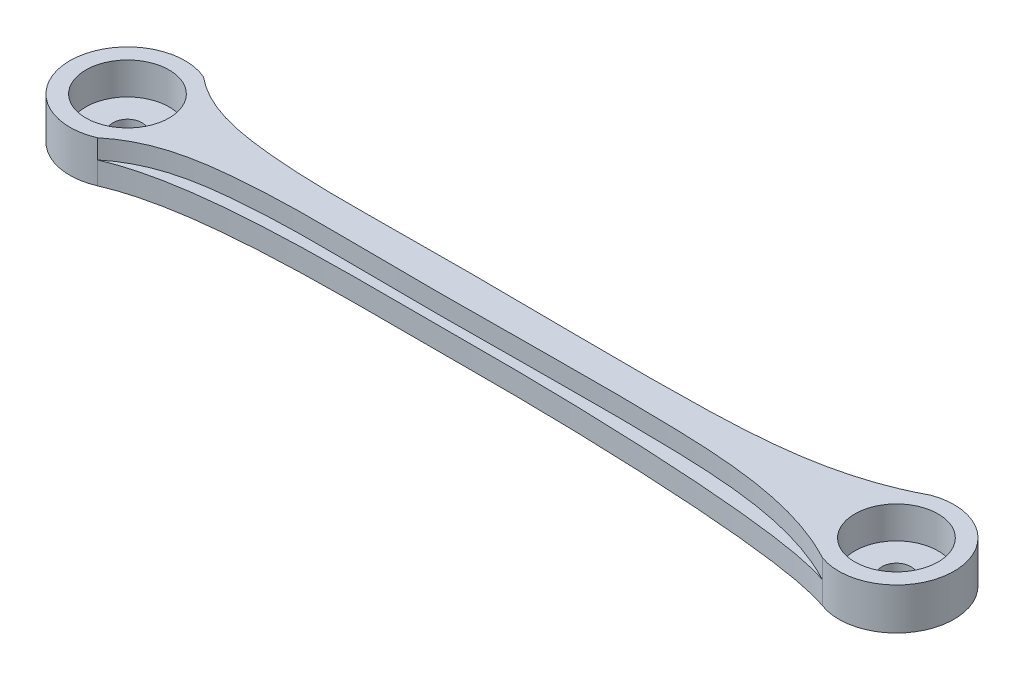
ISO-10303-21;
HEADER;
FILE_DESCRIPTION(('STEP AP214'),'2;1');
FILE_NAME('part.step','',(''),(''),'','','');
FILE_SCHEMA(('AUTOMOTIVE_DESIGN { 1 0 10303 214 1 1 1 1 }'));
ENDSEC;
DATA;
#1=APPLICATION_CONTEXT('core data for automotive mechanical design processes');
#2=APPLICATION_PROTOCOL_DEFINITION('international standard','automotive_design',2000,#1);
#3=PRODUCT_CONTEXT('',#1,'mechanical');
#4=PRODUCT('Part','Part','',(#3));
#5=PRODUCT_RELATED_PRODUCT_CATEGORY('part','',(#4));
#6=PRODUCT_DEFINITION_FORMATION('','',#4);
#7=PRODUCT_DEFINITION_CONTEXT('part definition',#1,'design');
#8=PRODUCT_DEFINITION('design','',#6,#7);
#9=PRODUCT_DEFINITION_SHAPE('','',#8);
#10=(LENGTH_UNIT() NAMED_UNIT(*) SI_UNIT(.MILLI.,.METRE.));
#11=(NAMED_UNIT(*) PLANE_ANGLE_UNIT() SI_UNIT($,.RADIAN.));
#12=(NAMED_UNIT(*) SI_UNIT($,.STERADIAN.) SOLID_ANGLE_UNIT());
#13=UNCERTAINTY_MEASURE_WITH_UNIT(LENGTH_MEASURE(1.E-05),#10,'distance_accuracy_value','');
#14=(GEOMETRIC_REPRESENTATION_CONTEXT(3) GLOBAL_UNCERTAINTY_ASSIGNED_CONTEXT((#13)) GLOBAL_UNIT_ASSIGNED_CONTEXT((#10,
#11,#12)) REPRESENTATION_CONTEXT('',''));
#15=CARTESIAN_POINT('',(0.,0.,0.));
#16=DIRECTION('',(0.,0.,1.));
#17=DIRECTION('',(1.,0.,0.));
#18=AXIS2_PLACEMENT_3D('',#15,#16,#17);
#19=CARTESIAN_POINT('',(-116.409605107802,6.5,8.25282160949067));
#20=CARTESIAN_POINT('',(-105.478903695318,6.5,3.49741353494902));
#21=CARTESIAN_POINT('',(-80.5323545025586,6.5,4.12846793017174));
#22=CARTESIAN_POINT('',(-45.7008945092512,6.5,3.89262781188417));
#23=CARTESIAN_POINT('',(-12.0491512398829,6.5,5.20800150270852));
#24=CARTESIAN_POINT('',(-3.06491546388714,6.5,8.46205017706852));
#25=B_SPLINE_CURVE_WITH_KNOTS('',3,(#19,#20,#21,#22,#23,#24),.UNSPECIFIED.,.F.,.F.,(4,1,1,4),
(0.,0.514412912448133,0.614412912448133,1.),.UNSPECIFIED.);
#26=DIRECTION('',(0.,-1.,0.));
#27=VECTOR('',#26,1.);
#28=SURFACE_OF_LINEAR_EXTRUSION('',#25,#27);
#29=CARTESIAN_POINT('',(-116.409605107802,3.5,8.25282160949067));
#30=CARTESIAN_POINT('',(-105.478903695318,3.5,3.49741353494902));
#31=CARTESIAN_POINT('',(-80.5323545025586,3.5,4.12846793017174));
#32=CARTESIAN_POINT('',(-45.7008945092512,3.5,3.89262781188417));
#33=CARTESIAN_POINT('',(-12.0491512398829,3.5,5.20800150270852));
#34=CARTESIAN_POINT('',(-3.06491546388714,3.5,8.46205017706852));
#35=B_SPLINE_CURVE_WITH_KNOTS('',3,(#29,#30,#31,#32,#33,#34),.UNSPECIFIED.,.F.,.F.,(4,1,1,4),
(0.,0.514412912448133,0.614412912448133,1.),.UNSPECIFIED.);
#36=CARTESIAN_POINT('',(-116.409605107802,3.5,8.25282160949067));
#37=VERTEX_POINT('',#36);
#38=CARTESIAN_POINT('',(-3.06491546388714,3.5,8.46205017706852));
#39=VERTEX_POINT('',#38);
#40=EDGE_CURVE('E249',#37,#39,#35,.T.);
#41=ORIENTED_EDGE('',*,*,#40,.F.);
#42=DIRECTION('',(0.,-1.,0.));
#43=VECTOR('',#42,1.);
#44=CARTESIAN_POINT('',(-116.409605107802,6.5,8.25282160949072));
#45=LINE('',#44,#43);
#46=CARTESIAN_POINT('',(-116.409605107802,0.,8.25282160949072));
#47=VERTEX_POINT('',#46);
#48=EDGE_CURVE('E47',#37,#47,#45,.T.);
#49=ORIENTED_EDGE('',*,*,#48,.T.);
#50=CARTESIAN_POINT('',(-116.409605107802,0.,8.25282160949067));
#51=CARTESIAN_POINT('',(-105.478903695318,0.,3.49741353494902));
#52=CARTESIAN_POINT('',(-80.5323545025586,0.,4.12846793017174));
#53=CARTESIAN_POINT('',(-45.7008945092512,0.,3.89262781188417));
#54=CARTESIAN_POINT('',(-12.0491512398829,0.,5.20800150270852));
#55=CARTESIAN_POINT('',(-3.06491546388714,0.,8.46205017706852));
#56=B_SPLINE_CURVE_WITH_KNOTS('',3,(#50,#51,#52,#53,#54,#55),.UNSPECIFIED.,.F.,.F.,(4,1,1,4),
(0.,0.514412912448133,0.614412912448133,1.),.UNSPECIFIED.);
#57=CARTESIAN_POINT('',(-3.06491546388714,0.,8.46205017706852));
#58=VERTEX_POINT('',#57);
#59=EDGE_CURVE('E97',#47,#58,#56,.T.);
#60=ORIENTED_EDGE('',*,*,#59,.T.);
#61=DIRECTION('',(0.,-1.,0.));
#62=VECTOR('',#61,1.);
#63=CARTESIAN_POINT('',(-3.06491546388714,6.5,8.46205017706852));
#64=LINE('',#63,#62);
#65=EDGE_CURVE('E127',#39,#58,#64,.T.);
#66=ORIENTED_EDGE('',*,*,#65,.F.);
#67=EDGE_LOOP('',(#41,#49,#60,#66));
#68=FACE_BOUND('',#67,.T.);
#69=ADVANCED_FACE('F35',(#68),#28,.F.);
#70=CARTESIAN_POINT('',(-116.409605107802,6.5,-8.25282160949067));
#71=CARTESIAN_POINT('',(-105.478903695318,6.5,-3.49741353494902));
#72=CARTESIAN_POINT('',(-80.5323545025586,6.5,-4.12846793017174));
#73=CARTESIAN_POINT('',(-45.7008945092512,6.5,-3.89262781188417));
#74=CARTESIAN_POINT('',(-12.0491512398829,6.5,-5.20800150270852));
#75=CARTESIAN_POINT('',(-3.06491546388714,6.5,-8.46205017706852));
#76=B_SPLINE_CURVE_WITH_KNOTS('',3,(#70,#71,#72,#73,#74,#75),.UNSPECIFIED.,.F.,.F.,(4,1,1,4),
(0.,0.514412912448133,0.614412912448133,1.),.UNSPECIFIED.);
#77=DIRECTION('',(0.,-1.,0.));
#78=VECTOR('',#77,1.);
#79=SURFACE_OF_LINEAR_EXTRUSION('',#76,#78);
#80=DIRECTION('',(0.,-1.,0.));
#81=VECTOR('',#80,1.);
#82=CARTESIAN_POINT('',(-116.409605107802,6.5,-8.25282160949072));
#83=LINE('',#82,#81);
#84=CARTESIAN_POINT('',(-116.409605107802,3.5,-8.25282160949067));
#85=VERTEX_POINT('',#84);
#86=CARTESIAN_POINT('',(-116.409605107802,0.,-8.25282160949072));
#87=VERTEX_POINT('',#86);
#88=EDGE_CURVE('E80',#85,#87,#83,.T.);
#89=ORIENTED_EDGE('',*,*,#88,.F.);
#90=CARTESIAN_POINT('',(-3.06491546388714,3.5,-8.46205017706852));
#91=CARTESIAN_POINT('',(-12.0491512398829,3.5,-5.20800150270852));
#92=CARTESIAN_POINT('',(-45.7008945092512,3.5,-3.89262781188417));
#93=CARTESIAN_POINT('',(-80.5323545025586,3.5,-4.12846793017174));
#94=CARTESIAN_POINT('',(-105.478903695318,3.5,-3.49741353494902));
#95=CARTESIAN_POINT('',(-116.409605107802,3.5,-8.25282160949067));
#96=B_SPLINE_CURVE_WITH_KNOTS('',3,(#90,#91,#92,#93,#94,#95),.UNSPECIFIED.,.F.,.F.,(4,1,1,4),
(0.,0.385587087551867,0.485587087551867,1.),.UNSPECIFIED.);
#97=CARTESIAN_POINT('',(-3.06491546388714,3.5,-8.46205017706852));
#98=VERTEX_POINT('',#97);
#99=EDGE_CURVE('E139',#98,#85,#96,.T.);
#100=ORIENTED_EDGE('',*,*,#99,.F.);
#101=DIRECTION('',(0.,-1.,0.));
#102=VECTOR('',#101,1.);
#103=CARTESIAN_POINT('',(-3.06491546388714,6.5,-8.46205017706852));
#104=LINE('',#103,#102);
#105=CARTESIAN_POINT('',(-3.06491546388714,0.,-8.46205017706852));
#106=VERTEX_POINT('',#105);
#107=EDGE_CURVE('E74',#98,#106,#104,.T.);
#108=ORIENTED_EDGE('',*,*,#107,.T.);
#109=CARTESIAN_POINT('',(-116.409605107802,0.,-8.25282160949067));
#110=CARTESIAN_POINT('',(-105.478903695318,0.,-3.49741353494902));
#111=CARTESIAN_POINT('',(-80.5323545025586,0.,-4.12846793017174));
#112=CARTESIAN_POINT('',(-45.7008945092512,0.,-3.89262781188417));
#113=CARTESIAN_POINT('',(-12.0491512398829,0.,-5.20800150270852));
#114=CARTESIAN_POINT('',(-3.06491546388714,0.,-8.46205017706852));
#115=B_SPLINE_CURVE_WITH_KNOTS('',3,(#109,#110,#111,#112,#113,#114),.UNSPECIFIED.,.F.,.F.,(4,1,
1,4),(0.,0.514412912448133,0.614412912448133,1.),.UNSPECIFIED.);
#116=EDGE_CURVE('E95',#87,#106,#115,.T.);
#117=ORIENTED_EDGE('',*,*,#116,.F.);
#118=EDGE_LOOP('',(#89,#100,#108,#117));
#119=FACE_BOUND('',#118,.T.);
#120=ADVANCED_FACE('F100',(#119),#79,.T.);
#121=CARTESIAN_POINT('',(0.,6.5,0.));
#122=DIRECTION('',(0.,1.,0.));
#123=DIRECTION('',(0.,0.,1.));
#124=AXIS2_PLACEMENT_3D('',#121,#122,#123);
#125=PLANE('',#124);
#126=CARTESIAN_POINT('',(-120.,6.5,0.));
#127=DIRECTION('',(0.,1.,0.));
#128=DIRECTION('',(0.,0.,1.));
#129=AXIS2_PLACEMENT_3D('',#126,#127,#128);
#130=CIRCLE('',#129,6.5);
#131=CARTESIAN_POINT('',(-120.,6.5,6.5));
#132=VERTEX_POINT('',#131);
#133=EDGE_CURVE('E258',#132,#132,#130,.T.);
#134=ORIENTED_EDGE('',*,*,#133,.F.);
#135=EDGE_LOOP('',(#134));
#136=FACE_BOUND('',#135,.T.);
#137=CARTESIAN_POINT('',(0.,6.5,0.));
#138=DIRECTION('',(0.,1.,0.));
#139=DIRECTION('',(0.,0.,1.));
#140=AXIS2_PLACEMENT_3D('',#137,#138,#139);
#141=CIRCLE('',#140,6.5);
#142=CARTESIAN_POINT('',(0.,6.5,6.5));
#143=VERTEX_POINT('',#142);
#144=EDGE_CURVE('E250',#143,#143,#141,.T.);
#145=ORIENTED_EDGE('',*,*,#144,.F.);
#146=EDGE_LOOP('',(#145));
#147=FACE_BOUND('',#146,.T.);
#148=CARTESIAN_POINT('',(-120.,6.5,0.));
#149=DIRECTION('',(0.,1.,0.));
#150=DIRECTION('',(0.,0.,1.));
#151=AXIS2_PLACEMENT_3D('',#148,#149,#150);
#152=CIRCLE('',#151,9.00000000000001);
#153=CARTESIAN_POINT('',(-116.409605107802,6.5,-8.25282160949072));
#154=VERTEX_POINT('',#153);
#155=CARTESIAN_POINT('',(-116.409605107802,6.5,8.25282160949067));
#156=VERTEX_POINT('',#155);
#157=EDGE_CURVE('E105',#154,#156,#152,.T.);
#158=ORIENTED_EDGE('',*,*,#157,.T.);
#159=CARTESIAN_POINT('',(-116.409605107802,6.5,8.25282160949072));
#160=CARTESIAN_POINT('',(-111.92652513617,6.5,4.51507354203544));
#161=CARTESIAN_POINT('',(-103.615159098178,6.5,3.00784573614782));
#162=CARTESIAN_POINT('',(-91.2207000098577,6.5,2.34725529869159));
#163=CARTESIAN_POINT('',(-77.8490213730049,6.5,2.56845612583095));
#164=CARTESIAN_POINT('',(-58.0096037549966,6.5,2.53414615049835));
#165=CARTESIAN_POINT('',(-32.0984882387546,6.5,2.11769764582483));
#166=CARTESIAN_POINT('',(-12.4420818931349,6.5,3.45207722822936));
#167=CARTESIAN_POINT('',(-3.06491546388714,6.5,8.46205017706852));
#168=B_SPLINE_CURVE_WITH_KNOTS('',3,(#159,#160,#161,#162,#163,#164,#165,#166,#167),
.UNSPECIFIED.,.F.,.F.,(4,1,1,1,1,1,4),(0.,0.145433364154235,0.214931864826638,0.323765467036158,
0.493222334574271,0.731337307454408,1.),.UNSPECIFIED.);
#169=CARTESIAN_POINT('',(-3.06491546388714,6.5,8.46205017706852));
#170=VERTEX_POINT('',#169);
#171=EDGE_CURVE('E154',#156,#170,#168,.T.);
#172=ORIENTED_EDGE('',*,*,#171,.T.);
#173=CARTESIAN_POINT('',(0.,6.5,0.));
#174=DIRECTION('',(0.,1.,0.));
#175=DIRECTION('',(0.,0.,1.));
#176=AXIS2_PLACEMENT_3D('',#173,#174,#175);
#177=CIRCLE('',#176,9.);
#178=CARTESIAN_POINT('',(-3.06491546388714,6.5,-8.46205017706852));
#179=VERTEX_POINT('',#178);
#180=EDGE_CURVE('E87',#170,#179,#177,.T.);
#181=ORIENTED_EDGE('',*,*,#180,.T.);
#182=CARTESIAN_POINT('',(-116.409605107802,6.5,-8.25282160949072));
#183=CARTESIAN_POINT('',(-111.92652513617,6.5,-4.51507354203544));
#184=CARTESIAN_POINT('',(-103.615159098178,6.5,-3.00784573614782));
#185=CARTESIAN_POINT('',(-91.2207000098578,6.5,-2.34725529869159));
#186=CARTESIAN_POINT('',(-77.8490213730049,6.5,-2.56845612583095));
#187=CARTESIAN_POINT('',(-58.0096037549966,6.5,-2.53414615049835));
#188=CARTESIAN_POINT('',(-32.0984882387547,6.5,-2.11769764582483));
#189=CARTESIAN_POINT('',(-12.4420818931349,6.5,-3.45207722822936));
#190=CARTESIAN_POINT('',(-3.06491546388714,6.5,-8.46205017706852));
#191=B_SPLINE_CURVE_WITH_KNOTS('',3,(#182,#183,#184,#185,#186,#187,#188,#189,#190),
.UNSPECIFIED.,.F.,.F.,(4,1,1,1,1,1,4),(0.,0.145433364154235,0.214931864826638,0.323765467036158,
0.493222334574271,0.731337307454408,1.),.UNSPECIFIED.);
#192=EDGE_CURVE('E143',#154,#179,#191,.T.);
#193=ORIENTED_EDGE('',*,*,#192,.F.);
#194=EDGE_LOOP('',(#158,#172,#181,#193));
#195=FACE_BOUND('',#194,.T.);
#196=ADVANCED_FACE('F194',(#136,#147,#195),#125,.T.);
#197=CARTESIAN_POINT('',(-120.,6.5,0.));
#198=DIRECTION('',(0.,-1.,0.));
#199=DIRECTION('',(0.,0.,-1.));
#200=AXIS2_PLACEMENT_3D('',#197,#198,#199);
#201=CYLINDRICAL_SURFACE('',#200,2.25);
#202=CARTESIAN_POINT('',(-120.,0.,0.));
#203=DIRECTION('',(0.,1.,0.));
#204=DIRECTION('',(0.,0.,1.));
#205=AXIS2_PLACEMENT_3D('',#202,#203,#204);
#206=CIRCLE('',#205,2.25);
#207=CARTESIAN_POINT('',(-120.,0.,-2.25));
#208=VERTEX_POINT('',#207);
#209=EDGE_CURVE('E98',#208,#208,#206,.T.);
#210=CARTESIAN_POINT('',(-120.,1.5,0.));
#211=DIRECTION('',(0.,1.,0.));
#212=DIRECTION('',(0.,0.,1.));
#213=AXIS2_PLACEMENT_3D('',#210,#211,#212);
#214=CIRCLE('',#213,2.25);
#215=CARTESIAN_POINT('',(-120.,1.5,-2.25));
#216=VERTEX_POINT('',#215);
#217=EDGE_CURVE('E220',#216,#216,#214,.T.);
#218=CARTESIAN_POINT('',(-120.,0.,-2.25));
#219=CARTESIAN_POINT('',(-120.,0.015625,-2.25));
#220=CARTESIAN_POINT('',(-120.,0.03125,-2.25));
#221=CARTESIAN_POINT('',(-120.,0.0625000000000001,-2.25));
#222=CARTESIAN_POINT('',(-120.,0.0781250000000001,-2.25));
#223=CARTESIAN_POINT('',(-120.,0.109375,-2.25));
#224=CARTESIAN_POINT('',(-120.,0.125,-2.25));
#225=CARTESIAN_POINT('',(-120.,0.15625,-2.25));
#226=CARTESIAN_POINT('',(-120.,0.171875,-2.25));
#227=CARTESIAN_POINT('',(-120.,0.203125,-2.25));
#228=CARTESIAN_POINT('',(-120.,0.21875,-2.25));
#229=CARTESIAN_POINT('',(-120.,0.25,-2.25));
#230=CARTESIAN_POINT('',(-120.,0.265625,-2.25));
#231=CARTESIAN_POINT('',(-120.,0.296875,-2.25));
#232=CARTESIAN_POINT('',(-120.,0.3125,-2.25));
#233=CARTESIAN_POINT('',(-120.,0.34375,-2.25));
#234=CARTESIAN_POINT('',(-120.,0.359375,-2.25));
#235=CARTESIAN_POINT('',(-120.,0.390625,-2.25));
#236=CARTESIAN_POINT('',(-120.,0.40625,-2.25));
#237=CARTESIAN_POINT('',(-120.,0.4375,-2.25));
#238=CARTESIAN_POINT('',(-120.,0.453125,-2.25));
#239=CARTESIAN_POINT('',(-120.,0.484375,-2.25));
#240=CARTESIAN_POINT('',(-120.,0.5,-2.25));
#241=CARTESIAN_POINT('',(-120.,0.53125,-2.25));
#242=CARTESIAN_POINT('',(-120.,0.546875,-2.25));
#243=CARTESIAN_POINT('',(-120.,0.578125,-2.25));
#244=CARTESIAN_POINT('',(-120.,0.59375,-2.25));
#245=CARTESIAN_POINT('',(-120.,0.625,-2.25));
#246=CARTESIAN_POINT('',(-120.,0.640625,-2.25));
#247=CARTESIAN_POINT('',(-120.,0.671875,-2.25));
#248=CARTESIAN_POINT('',(-120.,0.6875,-2.25));
#249=CARTESIAN_POINT('',(-120.,0.71875,-2.25));
#250=CARTESIAN_POINT('',(-120.,0.734375,-2.25));
#251=CARTESIAN_POINT('',(-120.,0.765625,-2.25));
#252=CARTESIAN_POINT('',(-120.,0.78125,-2.25));
#253=CARTESIAN_POINT('',(-120.,0.8125,-2.25));
#254=CARTESIAN_POINT('',(-120.,0.828125,-2.25));
#255=CARTESIAN_POINT('',(-120.,0.859375,-2.25));
#256=CARTESIAN_POINT('',(-120.,0.875,-2.25));
#257=CARTESIAN_POINT('',(-120.,0.90625,-2.25));
#258=CARTESIAN_POINT('',(-120.,0.921875,-2.25));
#259=CARTESIAN_POINT('',(-120.,0.953125,-2.25));
#260=CARTESIAN_POINT('',(-120.,0.96875,-2.25));
#261=CARTESIAN_POINT('',(-120.,1.,-2.25));
#262=CARTESIAN_POINT('',(-120.,1.015625,-2.25));
#263=CARTESIAN_POINT('',(-120.,1.046875,-2.25));
#264=CARTESIAN_POINT('',(-120.,1.0625,-2.25));
#265=CARTESIAN_POINT('',(-120.,1.09375,-2.25));
#266=CARTESIAN_POINT('',(-120.,1.109375,-2.25));
#267=CARTESIAN_POINT('',(-120.,1.140625,-2.25));
#268=CARTESIAN_POINT('',(-120.,1.15625,-2.25));
#269=CARTESIAN_POINT('',(-120.,1.1875,-2.25));
#270=CARTESIAN_POINT('',(-120.,1.203125,-2.25));
#271=CARTESIAN_POINT('',(-120.,1.234375,-2.25));
#272=CARTESIAN_POINT('',(-120.,1.25,-2.25));
#273=CARTESIAN_POINT('',(-120.,1.28125,-2.25));
#274=CARTESIAN_POINT('',(-120.,1.296875,-2.25));
#275=CARTESIAN_POINT('',(-120.,1.328125,-2.25));
#276=CARTESIAN_POINT('',(-120.,1.34375,-2.25));
#277=CARTESIAN_POINT('',(-120.,1.375,-2.25));
#278=CARTESIAN_POINT('',(-120.,1.390625,-2.25));
#279=CARTESIAN_POINT('',(-120.,1.421875,-2.25));
#280=CARTESIAN_POINT('',(-120.,1.4375,-2.25));
#281=CARTESIAN_POINT('',(-120.,1.46875,-2.25));
#282=CARTESIAN_POINT('',(-120.,1.484375,-2.25));
#283=CARTESIAN_POINT('',(-120.,1.5,-2.25));
#284=B_SPLINE_CURVE_WITH_KNOTS('',3,(#218,#219,#220,#221,#222,#223,#224,#225,#226,#227,#228,
#229,#230,#231,#232,#233,#234,#235,#236,#237,#238,#239,#240,#241,#242,#243,#244,#245,#246,#247,
#248,#249,#250,#251,#252,#253,#254,#255,#256,#257,#258,#259,#260,#261,#262,#263,#264,#265,#266,
#267,#268,#269,#270,#271,#272,#273,#274,#275,#276,#277,#278,#279,#280,#281,#282,#283),
.UNSPECIFIED.,.F.,.F.,(4,2,2,2,2,2,2,2,2,2,2,2,2,2,2,2,2,2,2,2,2,2,2,2,2,2,2,2,2,2,2,2,4),(0.,
0.046875,0.0937500000000001,0.140625,0.1875,0.234375,0.28125,0.328125,0.375,0.421875,0.46875,
0.515625,0.5625,0.609375,0.65625,0.703125,0.75,0.796875,0.84375,0.890625,0.9375,0.984375,
1.03125,1.078125,1.125,1.171875,1.21875,1.265625,1.3125,1.359375,1.40625,1.453125,1.5),.UNSPECIFIED.);
#285=EDGE_CURVE('BSEAM37',#208,#216,#284,.T.);
#286=ORIENTED_EDGE('',*,*,#209,.F.);
#287=ORIENTED_EDGE('',*,*,#217,.T.);
#288=ORIENTED_EDGE('',*,*,#285,.T.);
#289=ORIENTED_EDGE('',*,*,#285,.F.);
#290=EDGE_LOOP('',(#286,#288,#287,#289));
#291=FACE_BOUND('',#290,.T.);
#292=ADVANCED_FACE('F37',(#291),#201,.F.);
#293=CARTESIAN_POINT('',(0.,6.5,0.));
#294=DIRECTION('',(0.,-1.,0.));
#295=DIRECTION('',(0.,0.,-1.));
#296=AXIS2_PLACEMENT_3D('',#293,#294,#295);
#297=CYLINDRICAL_SURFACE('',#296,2.25);
#298=CARTESIAN_POINT('',(0.,0.,0.));
#299=DIRECTION('',(0.,1.,0.));
#300=DIRECTION('',(0.,0.,1.));
#301=AXIS2_PLACEMENT_3D('',#298,#299,#300);
#302=CIRCLE('',#301,2.25);
#303=CARTESIAN_POINT('',(0.,0.,-2.25));
#304=VERTEX_POINT('',#303);
#305=EDGE_CURVE('E101',#304,#304,#302,.T.);
#306=CARTESIAN_POINT('',(0.,1.5,0.));
#307=DIRECTION('',(0.,1.,0.));
#308=DIRECTION('',(0.,0.,1.));
#309=AXIS2_PLACEMENT_3D('',#306,#307,#308);
#310=CIRCLE('',#309,2.25);
#311=CARTESIAN_POINT('',(0.,1.5,-2.25));
#312=VERTEX_POINT('',#311);
#313=EDGE_CURVE('E136',#312,#312,#310,.T.);
#314=CARTESIAN_POINT('',(0.,0.,-2.25));
#315=CARTESIAN_POINT('',(0.,0.015625,-2.25));
#316=CARTESIAN_POINT('',(0.,0.03125,-2.25));
#317=CARTESIAN_POINT('',(0.,0.0625000000000001,-2.25));
#318=CARTESIAN_POINT('',(0.,0.0781250000000001,-2.25));
#319=CARTESIAN_POINT('',(0.,0.109375,-2.25));
#320=CARTESIAN_POINT('',(0.,0.125,-2.25));
#321=CARTESIAN_POINT('',(0.,0.15625,-2.25));
#322=CARTESIAN_POINT('',(0.,0.171875,-2.25));
#323=CARTESIAN_POINT('',(0.,0.203125,-2.25));
#324=CARTESIAN_POINT('',(0.,0.21875,-2.25));
#325=CARTESIAN_POINT('',(0.,0.25,-2.25));
#326=CARTESIAN_POINT('',(0.,0.265625,-2.25));
#327=CARTESIAN_POINT('',(0.,0.296875,-2.25));
#328=CARTESIAN_POINT('',(0.,0.3125,-2.25));
#329=CARTESIAN_POINT('',(0.,0.34375,-2.25));
#330=CARTESIAN_POINT('',(0.,0.359375,-2.25));
#331=CARTESIAN_POINT('',(0.,0.390625,-2.25));
#332=CARTESIAN_POINT('',(0.,0.40625,-2.25));
#333=CARTESIAN_POINT('',(0.,0.4375,-2.25));
#334=CARTESIAN_POINT('',(0.,0.453125,-2.25));
#335=CARTESIAN_POINT('',(0.,0.484375,-2.25));
#336=CARTESIAN_POINT('',(0.,0.5,-2.25));
#337=CARTESIAN_POINT('',(0.,0.53125,-2.25));
#338=CARTESIAN_POINT('',(0.,0.546875,-2.25));
#339=CARTESIAN_POINT('',(0.,0.578125,-2.25));
#340=CARTESIAN_POINT('',(0.,0.59375,-2.25));
#341=CARTESIAN_POINT('',(0.,0.625,-2.25));
#342=CARTESIAN_POINT('',(0.,0.640625,-2.25));
#343=CARTESIAN_POINT('',(0.,0.671875,-2.25));
#344=CARTESIAN_POINT('',(0.,0.6875,-2.25));
#345=CARTESIAN_POINT('',(0.,0.71875,-2.25));
#346=CARTESIAN_POINT('',(0.,0.734375,-2.25));
#347=CARTESIAN_POINT('',(0.,0.765625,-2.25));
#348=CARTESIAN_POINT('',(0.,0.78125,-2.25));
#349=CARTESIAN_POINT('',(0.,0.8125,-2.25));
#350=CARTESIAN_POINT('',(0.,0.828125,-2.25));
#351=CARTESIAN_POINT('',(0.,0.859375,-2.25));
#352=CARTESIAN_POINT('',(0.,0.875,-2.25));
#353=CARTESIAN_POINT('',(0.,0.90625,-2.25));
#354=CARTESIAN_POINT('',(0.,0.921875,-2.25));
#355=CARTESIAN_POINT('',(0.,0.953125,-2.25));
#356=CARTESIAN_POINT('',(0.,0.96875,-2.25));
#357=CARTESIAN_POINT('',(0.,1.,-2.25));
#358=CARTESIAN_POINT('',(0.,1.015625,-2.25));
#359=CARTESIAN_POINT('',(0.,1.046875,-2.25));
#360=CARTESIAN_POINT('',(0.,1.0625,-2.25));
#361=CARTESIAN_POINT('',(0.,1.09375,-2.25));
#362=CARTESIAN_POINT('',(0.,1.109375,-2.25));
#363=CARTESIAN_POINT('',(0.,1.140625,-2.25));
#364=CARTESIAN_POINT('',(0.,1.15625,-2.25));
#365=CARTESIAN_POINT('',(0.,1.1875,-2.25));
#366=CARTESIAN_POINT('',(0.,1.203125,-2.25));
#367=CARTESIAN_POINT('',(0.,1.234375,-2.25));
#368=CARTESIAN_POINT('',(0.,1.25,-2.25));
#369=CARTESIAN_POINT('',(0.,1.28125,-2.25));
#370=CARTESIAN_POINT('',(0.,1.296875,-2.25));
#371=CARTESIAN_POINT('',(0.,1.328125,-2.25));
#372=CARTESIAN_POINT('',(0.,1.34375,-2.25));
#373=CARTESIAN_POINT('',(0.,1.375,-2.25));
#374=CARTESIAN_POINT('',(0.,1.390625,-2.25));
#375=CARTESIAN_POINT('',(0.,1.421875,-2.25));
#376=CARTESIAN_POINT('',(0.,1.4375,-2.25));
#377=CARTESIAN_POINT('',(0.,1.46875,-2.25));
#378=CARTESIAN_POINT('',(0.,1.484375,-2.25));
#379=CARTESIAN_POINT('',(0.,1.5,-2.25));
#380=B_SPLINE_CURVE_WITH_KNOTS('',3,(#314,#315,#316,#317,#318,#319,#320,#321,#322,#323,#324,
#325,#326,#327,#328,#329,#330,#331,#332,#333,#334,#335,#336,#337,#338,#339,#340,#341,#342,#343,
#344,#345,#346,#347,#348,#349,#350,#351,#352,#353,#354,#355,#356,#357,#358,#359,#360,#361,#362,
#363,#364,#365,#366,#367,#368,#369,#370,#371,#372,#373,#374,#375,#376,#377,#378,#379),
.UNSPECIFIED.,.F.,.F.,(4,2,2,2,2,2,2,2,2,2,2,2,2,2,2,2,2,2,2,2,2,2,2,2,2,2,2,2,2,2,2,2,4),(0.,
0.046875,0.0937500000000001,0.140625,0.1875,0.234375,0.28125,0.328125,0.375,0.421875,0.46875,
0.515625,0.5625,0.609375,0.65625,0.703125,0.75,0.796875,0.84375,0.890625,0.9375,0.984375,
1.03125,1.078125,1.125,1.171875,1.21875,1.265625,1.3125,1.359375,1.40625,1.453125,1.5),.UNSPECIFIED.);
#381=EDGE_CURVE('BSEAM202',#304,#312,#380,.T.);
#382=ORIENTED_EDGE('',*,*,#305,.F.);
#383=ORIENTED_EDGE('',*,*,#313,.T.);
#384=ORIENTED_EDGE('',*,*,#381,.T.);
#385=ORIENTED_EDGE('',*,*,#381,.F.);
#386=EDGE_LOOP('',(#382,#384,#383,#385));
#387=FACE_BOUND('',#386,.T.);
#388=ADVANCED_FACE('F202',(#387),#297,.F.);
#389=CARTESIAN_POINT('',(-120.,6.5,0.));
#390=DIRECTION('',(0.,-1.,0.));
#391=DIRECTION('',(0.,0.,-1.));
#392=AXIS2_PLACEMENT_3D('',#389,#390,#391);
#393=CYLINDRICAL_SURFACE('',#392,9.00000000000001);
#394=CARTESIAN_POINT('',(-120.,0.,0.));
#395=DIRECTION('',(0.,1.,0.));
#396=DIRECTION('',(0.,0.,1.));
#397=AXIS2_PLACEMENT_3D('',#394,#395,#396);
#398=CIRCLE('',#397,9.00000000000001);
#399=EDGE_CURVE('E84',#87,#47,#398,.T.);
#400=ORIENTED_EDGE('',*,*,#399,.T.);
#401=ORIENTED_EDGE('',*,*,#48,.F.);
#402=EDGE_CURVE('E11',#156,#37,#45,.T.);
#403=ORIENTED_EDGE('',*,*,#402,.F.);
#404=ORIENTED_EDGE('',*,*,#157,.F.);
#405=EDGE_CURVE('E56',#154,#85,#83,.T.);
#406=ORIENTED_EDGE('',*,*,#405,.T.);
#407=ORIENTED_EDGE('',*,*,#88,.T.);
#408=EDGE_LOOP('',(#400,#401,#403,#404,#406,#407));
#409=FACE_BOUND('',#408,.T.);
#410=ADVANCED_FACE('F82',(#409),#393,.T.);
#411=CARTESIAN_POINT('',(0.,6.5,0.));
#412=DIRECTION('',(0.,-1.,0.));
#413=DIRECTION('',(0.,0.,-1.));
#414=AXIS2_PLACEMENT_3D('',#411,#412,#413);
#415=CYLINDRICAL_SURFACE('',#414,9.);
#416=CARTESIAN_POINT('',(0.,0.,0.));
#417=DIRECTION('',(0.,1.,0.));
#418=DIRECTION('',(0.,0.,1.));
#419=AXIS2_PLACEMENT_3D('',#416,#417,#418);
#420=CIRCLE('',#419,9.);
#421=EDGE_CURVE('E102',#58,#106,#420,.T.);
#422=ORIENTED_EDGE('',*,*,#421,.T.);
#423=ORIENTED_EDGE('',*,*,#107,.F.);
#424=EDGE_CURVE('E124',#179,#98,#104,.T.);
#425=ORIENTED_EDGE('',*,*,#424,.F.);
#426=ORIENTED_EDGE('',*,*,#180,.F.);
#427=EDGE_CURVE('E129',#170,#39,#64,.T.);
#428=ORIENTED_EDGE('',*,*,#427,.T.);
#429=ORIENTED_EDGE('',*,*,#65,.T.);
#430=EDGE_LOOP('',(#422,#423,#425,#426,#428,#429));
#431=FACE_BOUND('',#430,.T.);
#432=ADVANCED_FACE('F200',(#431),#415,.T.);
#433=CARTESIAN_POINT('',(0.,0.,0.));
#434=DIRECTION('',(0.,1.,0.));
#435=DIRECTION('',(0.,0.,1.));
#436=AXIS2_PLACEMENT_3D('',#433,#434,#435);
#437=PLANE('',#436);
#438=ORIENTED_EDGE('',*,*,#209,.T.);
#439=EDGE_LOOP('',(#438));
#440=FACE_BOUND('',#439,.T.);
#441=ORIENTED_EDGE('',*,*,#399,.F.);
#442=ORIENTED_EDGE('',*,*,#116,.T.);
#443=ORIENTED_EDGE('',*,*,#421,.F.);
#444=ORIENTED_EDGE('',*,*,#59,.F.);
#445=EDGE_LOOP('',(#441,#442,#443,#444));
#446=FACE_BOUND('',#445,.T.);
#447=ORIENTED_EDGE('',*,*,#305,.T.);
#448=EDGE_LOOP('',(#447));
#449=FACE_BOUND('',#448,.T.);
#450=ADVANCED_FACE('F92',(#440,#446,#449),#437,.F.);
#451=CARTESIAN_POINT('',(0.,1.5,0.));
#452=DIRECTION('',(0.,1.,0.));
#453=DIRECTION('',(0.,0.,1.));
#454=AXIS2_PLACEMENT_3D('',#451,#452,#453);
#455=CYLINDRICAL_SURFACE('',#454,6.5);
#456=CARTESIAN_POINT('',(0.,1.5,0.));
#457=DIRECTION('',(0.,1.,0.));
#458=DIRECTION('',(0.,0.,1.));
#459=AXIS2_PLACEMENT_3D('',#456,#457,#458);
#460=CIRCLE('',#459,6.5);
#461=CARTESIAN_POINT('',(0.,1.5,6.5));
#462=VERTEX_POINT('',#461);
#463=EDGE_CURVE('E253',#462,#462,#460,.T.);
#464=ORIENTED_EDGE('',*,*,#463,.F.);
#465=EDGE_LOOP('',(#464));
#466=FACE_BOUND('',#465,.T.);
#467=ORIENTED_EDGE('',*,*,#144,.T.);
#468=EDGE_LOOP('',(#467));
#469=FACE_BOUND('',#468,.T.);
#470=ADVANCED_FACE('F189',(#466,#469),#455,.F.);
#471=CARTESIAN_POINT('',(0.,1.5,0.));
#472=DIRECTION('',(0.,1.,0.));
#473=DIRECTION('',(0.,0.,1.));
#474=AXIS2_PLACEMENT_3D('',#471,#472,#473);
#475=PLANE('',#474);
#476=ORIENTED_EDGE('',*,*,#313,.F.);
#477=EDGE_LOOP('',(#476));
#478=FACE_BOUND('',#477,.T.);
#479=ORIENTED_EDGE('',*,*,#463,.T.);
#480=EDGE_LOOP('',(#479));
#481=FACE_BOUND('',#480,.T.);
#482=ADVANCED_FACE('F185',(#478,#481),#475,.T.);
#483=CARTESIAN_POINT('',(-120.,1.5,0.));
#484=DIRECTION('',(0.,1.,0.));
#485=DIRECTION('',(0.,0.,1.));
#486=AXIS2_PLACEMENT_3D('',#483,#484,#485);
#487=CYLINDRICAL_SURFACE('',#486,6.5);
#488=CARTESIAN_POINT('',(-120.,1.5,0.));
#489=DIRECTION('',(0.,1.,0.));
#490=DIRECTION('',(0.,0.,1.));
#491=AXIS2_PLACEMENT_3D('',#488,#489,#490);
#492=CIRCLE('',#491,6.5);
#493=CARTESIAN_POINT('',(-120.,1.5,6.5));
#494=VERTEX_POINT('',#493);
#495=EDGE_CURVE('E390',#494,#494,#492,.T.);
#496=ORIENTED_EDGE('',*,*,#495,.F.);
#497=EDGE_LOOP('',(#496));
#498=FACE_BOUND('',#497,.T.);
#499=ORIENTED_EDGE('',*,*,#133,.T.);
#500=EDGE_LOOP('',(#499));
#501=FACE_BOUND('',#500,.T.);
#502=ADVANCED_FACE('F181',(#498,#501),#487,.F.);
#503=CARTESIAN_POINT('',(-120.,1.5,0.));
#504=DIRECTION('',(0.,1.,0.));
#505=DIRECTION('',(0.,0.,1.));
#506=AXIS2_PLACEMENT_3D('',#503,#504,#505);
#507=PLANE('',#506);
#508=ORIENTED_EDGE('',*,*,#217,.F.);
#509=EDGE_LOOP('',(#508));
#510=FACE_BOUND('',#509,.T.);
#511=ORIENTED_EDGE('',*,*,#495,.T.);
#512=EDGE_LOOP('',(#511));
#513=FACE_BOUND('',#512,.T.);
#514=ADVANCED_FACE('F177',(#510,#513),#507,.T.);
#515=CARTESIAN_POINT('',(-116.409605107802,3.5,-8.25282160949072));
#516=CARTESIAN_POINT('',(-111.92652513617,3.5,-4.51507354203544));
#517=CARTESIAN_POINT('',(-103.615159098178,3.5,-3.00784573614782));
#518=CARTESIAN_POINT('',(-91.2207000098578,3.5,-2.34725529869159));
#519=CARTESIAN_POINT('',(-77.8490213730049,3.5,-2.56845612583095));
#520=CARTESIAN_POINT('',(-58.0096037549966,3.5,-2.53414615049835));
#521=CARTESIAN_POINT('',(-32.0984882387547,3.5,-2.11769764582483));
#522=CARTESIAN_POINT('',(-12.4420818931349,3.5,-3.45207722822936));
#523=CARTESIAN_POINT('',(-3.06491546388714,3.5,-8.46205017706852));
#524=B_SPLINE_CURVE_WITH_KNOTS('',3,(#515,#516,#517,#518,#519,#520,#521,#522,#523),
.UNSPECIFIED.,.F.,.F.,(4,1,1,1,1,1,4),(0.,0.145433364154235,0.214931864826638,0.323765467036158,
0.493222334574271,0.731337307454408,1.),.UNSPECIFIED.);
#525=DIRECTION('',(0.,1.,0.));
#526=VECTOR('',#525,1.);
#527=SURFACE_OF_LINEAR_EXTRUSION('',#524,#526);
#528=ORIENTED_EDGE('',*,*,#192,.T.);
#529=ORIENTED_EDGE('',*,*,#424,.T.);
#530=EDGE_CURVE('E142',#85,#98,#524,.T.);
#531=ORIENTED_EDGE('',*,*,#530,.F.);
#532=ORIENTED_EDGE('',*,*,#405,.F.);
#533=EDGE_LOOP('',(#528,#529,#531,#532));
#534=FACE_BOUND('',#533,.T.);
#535=ADVANCED_FACE('F172',(#534),#527,.F.);
#536=CARTESIAN_POINT('',(0.,3.5,0.));
#537=DIRECTION('',(0.,1.,0.));
#538=DIRECTION('',(0.,0.,1.));
#539=AXIS2_PLACEMENT_3D('',#536,#537,#538);
#540=PLANE('',#539);
#541=ORIENTED_EDGE('',*,*,#99,.T.);
#542=ORIENTED_EDGE('',*,*,#530,.T.);
#543=EDGE_LOOP('',(#541,#542));
#544=FACE_BOUND('',#543,.T.);
#545=ADVANCED_FACE('F176',(#544),#540,.T.);
#546=CARTESIAN_POINT('',(-116.409605107802,3.5,8.25282160949072));
#547=CARTESIAN_POINT('',(-111.92652513617,3.5,4.51507354203544));
#548=CARTESIAN_POINT('',(-103.615159098178,3.5,3.00784573614782));
#549=CARTESIAN_POINT('',(-91.2207000098577,3.5,2.34725529869159));
#550=CARTESIAN_POINT('',(-77.8490213730049,3.5,2.56845612583095));
#551=CARTESIAN_POINT('',(-58.0096037549966,3.5,2.53414615049835));
#552=CARTESIAN_POINT('',(-32.0984882387546,3.5,2.11769764582483));
#553=CARTESIAN_POINT('',(-12.4420818931349,3.5,3.45207722822936));
#554=CARTESIAN_POINT('',(-3.06491546388714,3.5,8.46205017706852));
#555=B_SPLINE_CURVE_WITH_KNOTS('',3,(#546,#547,#548,#549,#550,#551,#552,#553,#554),
.UNSPECIFIED.,.F.,.F.,(4,1,1,1,1,1,4),(0.,0.145433364154235,0.214931864826638,0.323765467036158,
0.493222334574271,0.731337307454408,1.),.UNSPECIFIED.);
#556=DIRECTION('',(0.,1.,0.));
#557=VECTOR('',#556,1.);
#558=SURFACE_OF_LINEAR_EXTRUSION('',#555,#557);
#559=ORIENTED_EDGE('',*,*,#171,.F.);
#560=ORIENTED_EDGE('',*,*,#402,.T.);
#561=EDGE_CURVE('E155',#37,#39,#555,.T.);
#562=ORIENTED_EDGE('',*,*,#561,.T.);
#563=ORIENTED_EDGE('',*,*,#427,.F.);
#564=EDGE_LOOP('',(#559,#560,#562,#563));
#565=FACE_BOUND('',#564,.T.);
#566=ADVANCED_FACE('F241',(#565),#558,.T.);
#567=CARTESIAN_POINT('',(0.,3.5,0.));
#568=DIRECTION('',(0.,1.,0.));
#569=DIRECTION('',(0.,0.,1.));
#570=AXIS2_PLACEMENT_3D('',#567,#568,#569);
#571=PLANE('',#570);
#572=ORIENTED_EDGE('',*,*,#561,.F.);
#573=ORIENTED_EDGE('',*,*,#40,.T.);
#574=EDGE_LOOP('',(#572,#573));
#575=FACE_BOUND('',#574,.T.);
#576=ADVANCED_FACE('F314',(#575),#571,.T.);
#577=CLOSED_SHELL('',(#69,#120,#196,#292,#388,#410,#432,#450,#470,#482,#502,#514,#535,#545,#566,#576));
#578=MANIFOLD_SOLID_BREP('B2',#577);
#579=ADVANCED_BREP_SHAPE_REPRESENTATION('',(#18,#578),#14);
#580=SHAPE_DEFINITION_REPRESENTATION(#9,#579);
ENDSEC;
END-ISO-10303-21;
